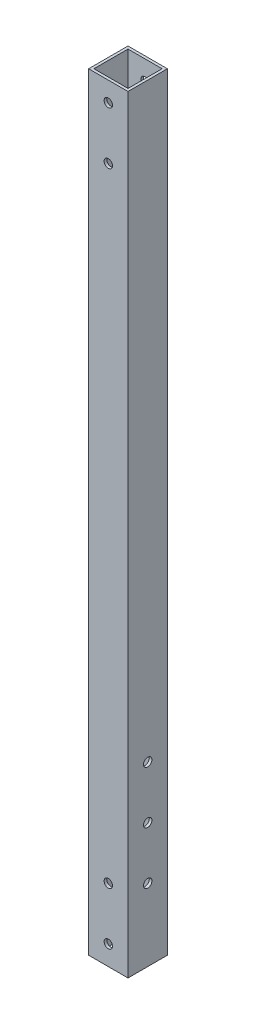
ISO-10303-21;
HEADER;
FILE_DESCRIPTION(('STEP AP214'),'2;1');
FILE_NAME('part.step','',(''),(''),'','','');
FILE_SCHEMA(('AUTOMOTIVE_DESIGN { 1 0 10303 214 1 1 1 1 }'));
ENDSEC;
DATA;
#1=APPLICATION_CONTEXT('core data for automotive mechanical design processes');
#2=APPLICATION_PROTOCOL_DEFINITION('international standard','automotive_design',2000,#1);
#3=PRODUCT_CONTEXT('',#1,'mechanical');
#4=PRODUCT('Part','Part','',(#3));
#5=PRODUCT_RELATED_PRODUCT_CATEGORY('part','',(#4));
#6=PRODUCT_DEFINITION_FORMATION('','',#4);
#7=PRODUCT_DEFINITION_CONTEXT('part definition',#1,'design');
#8=PRODUCT_DEFINITION('design','',#6,#7);
#9=PRODUCT_DEFINITION_SHAPE('','',#8);
#10=(LENGTH_UNIT() NAMED_UNIT(*) SI_UNIT(.MILLI.,.METRE.));
#11=(NAMED_UNIT(*) PLANE_ANGLE_UNIT() SI_UNIT($,.RADIAN.));
#12=(NAMED_UNIT(*) SI_UNIT($,.STERADIAN.) SOLID_ANGLE_UNIT());
#13=UNCERTAINTY_MEASURE_WITH_UNIT(LENGTH_MEASURE(1.E-05),#10,'distance_accuracy_value','');
#14=(GEOMETRIC_REPRESENTATION_CONTEXT(3) GLOBAL_UNCERTAINTY_ASSIGNED_CONTEXT((#13)) GLOBAL_UNIT_ASSIGNED_CONTEXT((#10,
#11,#12)) REPRESENTATION_CONTEXT('',''));
#15=CARTESIAN_POINT('',(0.,0.,0.));
#16=DIRECTION('',(0.,0.,1.));
#17=DIRECTION('',(1.,0.,0.));
#18=AXIS2_PLACEMENT_3D('',#15,#16,#17);
#19=CARTESIAN_POINT('',(0.,292.5,0.));
#20=DIRECTION('',(0.,1.,0.));
#21=DIRECTION('',(0.,0.,1.));
#22=AXIS2_PLACEMENT_3D('',#19,#20,#21);
#23=PLANE('',#22);
#24=DIRECTION('',(0.,0.,-1.));
#25=VECTOR('',#24,1.);
#26=CARTESIAN_POINT('',(7.5,292.5,7.5));
#27=LINE('',#26,#25);
#28=CARTESIAN_POINT('',(7.5,292.5,7.5));
#29=VERTEX_POINT('',#28);
#30=CARTESIAN_POINT('',(7.5,292.5,-7.5));
#31=VERTEX_POINT('',#30);
#32=EDGE_CURVE('E187',#29,#31,#27,.T.);
#33=ORIENTED_EDGE('',*,*,#32,.T.);
#34=DIRECTION('',(-1.,0.,0.));
#35=VECTOR('',#34,1.);
#36=CARTESIAN_POINT('',(-7.5,292.5,-7.5));
#37=LINE('',#36,#35);
#38=CARTESIAN_POINT('',(-7.5,292.5,-7.5));
#39=VERTEX_POINT('',#38);
#40=EDGE_CURVE('E191',#31,#39,#37,.T.);
#41=ORIENTED_EDGE('',*,*,#40,.T.);
#42=DIRECTION('',(0.,0.,1.));
#43=VECTOR('',#42,1.);
#44=CARTESIAN_POINT('',(-7.5,292.5,7.5));
#45=LINE('',#44,#43);
#46=CARTESIAN_POINT('',(-7.5,292.5,7.5));
#47=VERTEX_POINT('',#46);
#48=EDGE_CURVE('E195',#39,#47,#45,.T.);
#49=ORIENTED_EDGE('',*,*,#48,.T.);
#50=DIRECTION('',(1.,0.,0.));
#51=VECTOR('',#50,1.);
#52=CARTESIAN_POINT('',(-7.5,292.5,7.5));
#53=LINE('',#52,#51);
#54=EDGE_CURVE('E198',#47,#29,#53,.T.);
#55=ORIENTED_EDGE('',*,*,#54,.T.);
#56=EDGE_LOOP('',(#33,#41,#49,#55));
#57=FACE_BOUND('',#56,.T.);
#58=DIRECTION('',(-1.,0.,0.));
#59=VECTOR('',#58,1.);
#60=CARTESIAN_POINT('',(0.,292.5,-6.5));
#61=LINE('',#60,#59);
#62=CARTESIAN_POINT('',(6.5,292.5,-6.5));
#63=VERTEX_POINT('',#62);
#64=CARTESIAN_POINT('',(-6.5,292.5,-6.5));
#65=VERTEX_POINT('',#64);
#66=EDGE_CURVE('E146',#63,#65,#61,.T.);
#67=ORIENTED_EDGE('',*,*,#66,.F.);
#68=DIRECTION('',(0.,0.,-1.));
#69=VECTOR('',#68,1.);
#70=CARTESIAN_POINT('',(6.5,292.5,0.));
#71=LINE('',#70,#69);
#72=CARTESIAN_POINT('',(6.5,292.5,6.5));
#73=VERTEX_POINT('',#72);
#74=EDGE_CURVE('E137',#73,#63,#71,.T.);
#75=ORIENTED_EDGE('',*,*,#74,.F.);
#76=DIRECTION('',(1.,0.,0.));
#77=VECTOR('',#76,1.);
#78=CARTESIAN_POINT('',(0.,292.5,6.5));
#79=LINE('',#78,#77);
#80=CARTESIAN_POINT('',(-6.5,292.5,6.5));
#81=VERTEX_POINT('',#80);
#82=EDGE_CURVE('E163',#81,#73,#79,.T.);
#83=ORIENTED_EDGE('',*,*,#82,.F.);
#84=DIRECTION('',(0.,0.,1.));
#85=VECTOR('',#84,1.);
#86=CARTESIAN_POINT('',(-6.5,292.5,0.));
#87=LINE('',#86,#85);
#88=EDGE_CURVE('E159',#65,#81,#87,.T.);
#89=ORIENTED_EDGE('',*,*,#88,.F.);
#90=EDGE_LOOP('',(#67,#75,#83,#89));
#91=FACE_BOUND('',#90,.T.);
#92=ADVANCED_FACE('F69',(#57,#91),#23,.T.);
#93=CARTESIAN_POINT('',(0.,0.,0.));
#94=DIRECTION('',(0.,1.,0.));
#95=DIRECTION('',(0.,0.,1.));
#96=AXIS2_PLACEMENT_3D('',#93,#94,#95);
#97=PLANE('',#96);
#98=DIRECTION('',(0.,0.,-1.));
#99=VECTOR('',#98,1.);
#100=CARTESIAN_POINT('',(7.5,0.,7.5));
#101=LINE('',#100,#99);
#102=CARTESIAN_POINT('',(7.5,0.,7.5));
#103=VERTEX_POINT('',#102);
#104=CARTESIAN_POINT('',(7.5,0.,-7.5));
#105=VERTEX_POINT('',#104);
#106=EDGE_CURVE('E155',#103,#105,#101,.T.);
#107=ORIENTED_EDGE('',*,*,#106,.F.);
#108=DIRECTION('',(1.,0.,0.));
#109=VECTOR('',#108,1.);
#110=CARTESIAN_POINT('',(-7.5,0.,7.5));
#111=LINE('',#110,#109);
#112=CARTESIAN_POINT('',(-7.5,0.,7.5));
#113=VERTEX_POINT('',#112);
#114=EDGE_CURVE('E192',#113,#103,#111,.T.);
#115=ORIENTED_EDGE('',*,*,#114,.F.);
#116=DIRECTION('',(0.,0.,1.));
#117=VECTOR('',#116,1.);
#118=CARTESIAN_POINT('',(-7.5,0.,7.5));
#119=LINE('',#118,#117);
#120=CARTESIAN_POINT('',(-7.5,0.,-7.5));
#121=VERTEX_POINT('',#120);
#122=EDGE_CURVE('E208',#121,#113,#119,.T.);
#123=ORIENTED_EDGE('',*,*,#122,.F.);
#124=DIRECTION('',(-1.,0.,0.));
#125=VECTOR('',#124,1.);
#126=CARTESIAN_POINT('',(-7.5,0.,-7.5));
#127=LINE('',#126,#125);
#128=EDGE_CURVE('E205',#105,#121,#127,.T.);
#129=ORIENTED_EDGE('',*,*,#128,.F.);
#130=EDGE_LOOP('',(#107,#115,#123,#129));
#131=FACE_BOUND('',#130,.T.);
#132=DIRECTION('',(0.,0.,-1.));
#133=VECTOR('',#132,1.);
#134=CARTESIAN_POINT('',(6.5,0.,0.));
#135=LINE('',#134,#133);
#136=CARTESIAN_POINT('',(6.5,0.,6.5));
#137=VERTEX_POINT('',#136);
#138=CARTESIAN_POINT('',(6.5,0.,-6.5));
#139=VERTEX_POINT('',#138);
#140=EDGE_CURVE('E95',#137,#139,#135,.T.);
#141=ORIENTED_EDGE('',*,*,#140,.T.);
#142=DIRECTION('',(-1.,0.,0.));
#143=VECTOR('',#142,1.);
#144=CARTESIAN_POINT('',(0.,0.,-6.5));
#145=LINE('',#144,#143);
#146=CARTESIAN_POINT('',(-6.5,0.,-6.5));
#147=VERTEX_POINT('',#146);
#148=EDGE_CURVE('E153',#139,#147,#145,.T.);
#149=ORIENTED_EDGE('',*,*,#148,.T.);
#150=DIRECTION('',(0.,0.,1.));
#151=VECTOR('',#150,1.);
#152=CARTESIAN_POINT('',(-6.5,0.,0.));
#153=LINE('',#152,#151);
#154=CARTESIAN_POINT('',(-6.5,0.,6.5));
#155=VERTEX_POINT('',#154);
#156=EDGE_CURVE('E174',#147,#155,#153,.T.);
#157=ORIENTED_EDGE('',*,*,#156,.T.);
#158=DIRECTION('',(1.,0.,0.));
#159=VECTOR('',#158,1.);
#160=CARTESIAN_POINT('',(0.,0.,6.5));
#161=LINE('',#160,#159);
#162=EDGE_CURVE('E147',#155,#137,#161,.T.);
#163=ORIENTED_EDGE('',*,*,#162,.T.);
#164=EDGE_LOOP('',(#141,#149,#157,#163));
#165=FACE_BOUND('',#164,.T.);
#166=ADVANCED_FACE('F349',(#131,#165),#97,.F.);
#167=CARTESIAN_POINT('',(7.5,292.5,7.5));
#168=DIRECTION('',(-1.,0.,0.));
#169=DIRECTION('',(0.,0.,1.));
#170=AXIS2_PLACEMENT_3D('',#167,#168,#169);
#171=PLANE('',#170);
#172=CARTESIAN_POINT('',(7.5,27.5,0.));
#173=DIRECTION('',(1.,0.,0.));
#174=DIRECTION('',(0.,0.,-1.));
#175=AXIS2_PLACEMENT_3D('',#172,#173,#174);
#176=CIRCLE('',#175,1.6);
#177=CARTESIAN_POINT('',(7.5,27.5,-1.6));
#178=VERTEX_POINT('',#177);
#179=EDGE_CURVE('E398',#178,#178,#176,.T.);
#180=ORIENTED_EDGE('',*,*,#179,.F.);
#181=EDGE_LOOP('',(#180));
#182=FACE_BOUND('',#181,.T.);
#183=CARTESIAN_POINT('',(7.5,47.5,0.));
#184=DIRECTION('',(1.,0.,0.));
#185=DIRECTION('',(0.,0.,-1.));
#186=AXIS2_PLACEMENT_3D('',#183,#184,#185);
#187=CIRCLE('',#186,1.6);
#188=CARTESIAN_POINT('',(7.5,47.5,-1.6));
#189=VERTEX_POINT('',#188);
#190=EDGE_CURVE('E392',#189,#189,#187,.T.);
#191=ORIENTED_EDGE('',*,*,#190,.F.);
#192=EDGE_LOOP('',(#191));
#193=FACE_BOUND('',#192,.T.);
#194=CARTESIAN_POINT('',(7.5,67.5,0.));
#195=DIRECTION('',(1.,0.,0.));
#196=DIRECTION('',(0.,0.,-1.));
#197=AXIS2_PLACEMENT_3D('',#194,#195,#196);
#198=CIRCLE('',#197,1.60000000000001);
#199=CARTESIAN_POINT('',(7.5,67.5,-1.60000000000001));
#200=VERTEX_POINT('',#199);
#201=EDGE_CURVE('E386',#200,#200,#198,.T.);
#202=ORIENTED_EDGE('',*,*,#201,.F.);
#203=EDGE_LOOP('',(#202));
#204=FACE_BOUND('',#203,.T.);
#205=ORIENTED_EDGE('',*,*,#106,.T.);
#206=DIRECTION('',(0.,-1.,0.));
#207=VECTOR('',#206,1.);
#208=CARTESIAN_POINT('',(7.5,292.5,-7.5));
#209=LINE('',#208,#207);
#210=EDGE_CURVE('E12',#31,#105,#209,.T.);
#211=ORIENTED_EDGE('',*,*,#210,.F.);
#212=ORIENTED_EDGE('',*,*,#32,.F.);
#213=DIRECTION('',(0.,-1.,0.));
#214=VECTOR('',#213,1.);
#215=CARTESIAN_POINT('',(7.5,292.5,7.5));
#216=LINE('',#215,#214);
#217=EDGE_CURVE('E201',#29,#103,#216,.T.);
#218=ORIENTED_EDGE('',*,*,#217,.T.);
#219=EDGE_LOOP('',(#205,#211,#212,#218));
#220=FACE_BOUND('',#219,.T.);
#221=ADVANCED_FACE('F71',(#182,#193,#204,#220),#171,.F.);
#222=CARTESIAN_POINT('',(-7.5,292.5,-7.5));
#223=DIRECTION('',(0.,0.,1.));
#224=DIRECTION('',(1.,0.,0.));
#225=AXIS2_PLACEMENT_3D('',#222,#223,#224);
#226=PLANE('',#225);
#227=CARTESIAN_POINT('',(0.,7.5,-7.5));
#228=DIRECTION('',(0.,0.,1.));
#229=DIRECTION('',(1.,0.,0.));
#230=AXIS2_PLACEMENT_3D('',#227,#228,#229);
#231=CIRCLE('',#230,1.6);
#232=CARTESIAN_POINT('',(1.6,7.5,-7.5));
#233=VERTEX_POINT('',#232);
#234=EDGE_CURVE('E228',#233,#233,#231,.T.);
#235=ORIENTED_EDGE('',*,*,#234,.T.);
#236=EDGE_LOOP('',(#235));
#237=FACE_BOUND('',#236,.T.);
#238=CARTESIAN_POINT('',(0.,27.5,-7.5));
#239=DIRECTION('',(0.,0.,1.));
#240=DIRECTION('',(1.,0.,0.));
#241=AXIS2_PLACEMENT_3D('',#238,#239,#240);
#242=CIRCLE('',#241,1.6);
#243=CARTESIAN_POINT('',(1.6,27.5,-7.5));
#244=VERTEX_POINT('',#243);
#245=EDGE_CURVE('E282',#244,#244,#242,.T.);
#246=ORIENTED_EDGE('',*,*,#245,.T.);
#247=EDGE_LOOP('',(#246));
#248=FACE_BOUND('',#247,.T.);
#249=CARTESIAN_POINT('',(0.,265.,-7.5));
#250=DIRECTION('',(0.,0.,1.));
#251=DIRECTION('',(-1.,0.,0.));
#252=AXIS2_PLACEMENT_3D('',#249,#250,#251);
#253=CIRCLE('',#252,1.60000000000001);
#254=CARTESIAN_POINT('',(-1.60000000000001,265.,-7.5));
#255=VERTEX_POINT('',#254);
#256=EDGE_CURVE('E290',#255,#255,#253,.T.);
#257=ORIENTED_EDGE('',*,*,#256,.T.);
#258=EDGE_LOOP('',(#257));
#259=FACE_BOUND('',#258,.T.);
#260=CARTESIAN_POINT('',(0.,285.,-7.5));
#261=DIRECTION('',(0.,0.,1.));
#262=DIRECTION('',(-1.,0.,0.));
#263=AXIS2_PLACEMENT_3D('',#260,#261,#262);
#264=CIRCLE('',#263,1.59999999999999);
#265=CARTESIAN_POINT('',(-1.59999999999999,285.,-7.5));
#266=VERTEX_POINT('',#265);
#267=EDGE_CURVE('E270',#266,#266,#264,.T.);
#268=ORIENTED_EDGE('',*,*,#267,.T.);
#269=EDGE_LOOP('',(#268));
#270=FACE_BOUND('',#269,.T.);
#271=ORIENTED_EDGE('',*,*,#128,.T.);
#272=DIRECTION('',(0.,-1.,0.));
#273=VECTOR('',#272,1.);
#274=CARTESIAN_POINT('',(-7.5,292.5,-7.5));
#275=LINE('',#274,#273);
#276=EDGE_CURVE('E79',#39,#121,#275,.T.);
#277=ORIENTED_EDGE('',*,*,#276,.F.);
#278=ORIENTED_EDGE('',*,*,#40,.F.);
#279=ORIENTED_EDGE('',*,*,#210,.T.);
#280=EDGE_LOOP('',(#271,#277,#278,#279));
#281=FACE_BOUND('',#280,.T.);
#282=ADVANCED_FACE('F335',(#237,#248,#259,#270,#281),#226,.F.);
#283=CARTESIAN_POINT('',(-7.5,292.5,7.5));
#284=DIRECTION('',(1.,0.,0.));
#285=DIRECTION('',(0.,0.,-1.));
#286=AXIS2_PLACEMENT_3D('',#283,#284,#285);
#287=PLANE('',#286);
#288=CARTESIAN_POINT('',(-7.5,27.5,0.));
#289=DIRECTION('',(1.,0.,0.));
#290=DIRECTION('',(0.,0.,-1.));
#291=AXIS2_PLACEMENT_3D('',#288,#289,#290);
#292=CIRCLE('',#291,1.6);
#293=CARTESIAN_POINT('',(-7.5,27.5,-1.6));
#294=VERTEX_POINT('',#293);
#295=EDGE_CURVE('E247',#294,#294,#292,.T.);
#296=ORIENTED_EDGE('',*,*,#295,.T.);
#297=EDGE_LOOP('',(#296));
#298=FACE_BOUND('',#297,.T.);
#299=CARTESIAN_POINT('',(-7.5,47.5,0.));
#300=DIRECTION('',(1.,0.,0.));
#301=DIRECTION('',(0.,0.,-1.));
#302=AXIS2_PLACEMENT_3D('',#299,#300,#301);
#303=CIRCLE('',#302,1.6);
#304=CARTESIAN_POINT('',(-7.5,47.5,-1.6));
#305=VERTEX_POINT('',#304);
#306=EDGE_CURVE('E381',#305,#305,#303,.T.);
#307=ORIENTED_EDGE('',*,*,#306,.T.);
#308=EDGE_LOOP('',(#307));
#309=FACE_BOUND('',#308,.T.);
#310=CARTESIAN_POINT('',(-7.5,67.5,0.));
#311=DIRECTION('',(1.,0.,0.));
#312=DIRECTION('',(0.,0.,-1.));
#313=AXIS2_PLACEMENT_3D('',#310,#311,#312);
#314=CIRCLE('',#313,1.60000000000001);
#315=CARTESIAN_POINT('',(-7.5,67.5,-1.60000000000001));
#316=VERTEX_POINT('',#315);
#317=EDGE_CURVE('E263',#316,#316,#314,.T.);
#318=ORIENTED_EDGE('',*,*,#317,.T.);
#319=EDGE_LOOP('',(#318));
#320=FACE_BOUND('',#319,.T.);
#321=ORIENTED_EDGE('',*,*,#122,.T.);
#322=DIRECTION('',(0.,-1.,0.));
#323=VECTOR('',#322,1.);
#324=CARTESIAN_POINT('',(-7.5,292.5,7.5));
#325=LINE('',#324,#323);
#326=EDGE_CURVE('E216',#47,#113,#325,.T.);
#327=ORIENTED_EDGE('',*,*,#326,.F.);
#328=ORIENTED_EDGE('',*,*,#48,.F.);
#329=ORIENTED_EDGE('',*,*,#276,.T.);
#330=EDGE_LOOP('',(#321,#327,#328,#329));
#331=FACE_BOUND('',#330,.T.);
#332=ADVANCED_FACE('F338',(#298,#309,#320,#331),#287,.F.);
#333=CARTESIAN_POINT('',(-7.5,292.5,7.5));
#334=DIRECTION('',(0.,0.,-1.));
#335=DIRECTION('',(-1.,0.,0.));
#336=AXIS2_PLACEMENT_3D('',#333,#334,#335);
#337=PLANE('',#336);
#338=CARTESIAN_POINT('',(0.,7.5,7.5));
#339=DIRECTION('',(0.,0.,1.));
#340=DIRECTION('',(1.,0.,0.));
#341=AXIS2_PLACEMENT_3D('',#338,#339,#340);
#342=CIRCLE('',#341,1.6);
#343=CARTESIAN_POINT('',(1.6,7.5,7.5));
#344=VERTEX_POINT('',#343);
#345=EDGE_CURVE('E274',#344,#344,#342,.T.);
#346=ORIENTED_EDGE('',*,*,#345,.F.);
#347=EDGE_LOOP('',(#346));
#348=FACE_BOUND('',#347,.T.);
#349=CARTESIAN_POINT('',(0.,27.5,7.5));
#350=DIRECTION('',(0.,0.,1.));
#351=DIRECTION('',(1.,0.,0.));
#352=AXIS2_PLACEMENT_3D('',#349,#350,#351);
#353=CIRCLE('',#352,1.6);
#354=CARTESIAN_POINT('',(1.6,27.5,7.5));
#355=VERTEX_POINT('',#354);
#356=EDGE_CURVE('E278',#355,#355,#353,.T.);
#357=ORIENTED_EDGE('',*,*,#356,.F.);
#358=EDGE_LOOP('',(#357));
#359=FACE_BOUND('',#358,.T.);
#360=CARTESIAN_POINT('',(0.,265.,7.5));
#361=DIRECTION('',(0.,0.,1.));
#362=DIRECTION('',(-1.,0.,0.));
#363=AXIS2_PLACEMENT_3D('',#360,#361,#362);
#364=CIRCLE('',#363,1.60000000000001);
#365=CARTESIAN_POINT('',(-1.60000000000001,265.,7.5));
#366=VERTEX_POINT('',#365);
#367=EDGE_CURVE('E286',#366,#366,#364,.T.);
#368=ORIENTED_EDGE('',*,*,#367,.F.);
#369=EDGE_LOOP('',(#368));
#370=FACE_BOUND('',#369,.T.);
#371=CARTESIAN_POINT('',(0.,285.,7.5));
#372=DIRECTION('',(0.,0.,1.));
#373=DIRECTION('',(-1.,0.,0.));
#374=AXIS2_PLACEMENT_3D('',#371,#372,#373);
#375=CIRCLE('',#374,1.59999999999999);
#376=CARTESIAN_POINT('',(-1.59999999999999,285.,7.5));
#377=VERTEX_POINT('',#376);
#378=EDGE_CURVE('E294',#377,#377,#375,.T.);
#379=ORIENTED_EDGE('',*,*,#378,.F.);
#380=EDGE_LOOP('',(#379));
#381=FACE_BOUND('',#380,.T.);
#382=ORIENTED_EDGE('',*,*,#114,.T.);
#383=ORIENTED_EDGE('',*,*,#217,.F.);
#384=ORIENTED_EDGE('',*,*,#54,.F.);
#385=ORIENTED_EDGE('',*,*,#326,.T.);
#386=EDGE_LOOP('',(#382,#383,#384,#385));
#387=FACE_BOUND('',#386,.T.);
#388=ADVANCED_FACE('F353',(#348,#359,#370,#381,#387),#337,.F.);
#389=CARTESIAN_POINT('',(6.5,292.5,0.));
#390=DIRECTION('',(-1.,0.,0.));
#391=DIRECTION('',(0.,0.,1.));
#392=AXIS2_PLACEMENT_3D('',#389,#390,#391);
#393=PLANE('',#392);
#394=CARTESIAN_POINT('',(6.5,27.5,0.));
#395=DIRECTION('',(-1.,0.,0.));
#396=DIRECTION('',(0.,0.,1.));
#397=AXIS2_PLACEMENT_3D('',#394,#395,#396);
#398=CIRCLE('',#397,1.6);
#399=CARTESIAN_POINT('',(6.5,27.5,1.6));
#400=VERTEX_POINT('',#399);
#401=EDGE_CURVE('E266',#400,#400,#398,.T.);
#402=ORIENTED_EDGE('',*,*,#401,.F.);
#403=EDGE_LOOP('',(#402));
#404=FACE_BOUND('',#403,.T.);
#405=CARTESIAN_POINT('',(6.5,47.5,0.));
#406=DIRECTION('',(-1.,0.,0.));
#407=DIRECTION('',(0.,0.,1.));
#408=AXIS2_PLACEMENT_3D('',#405,#406,#407);
#409=CIRCLE('',#408,1.6);
#410=CARTESIAN_POINT('',(6.5,47.5,1.6));
#411=VERTEX_POINT('',#410);
#412=EDGE_CURVE('E251',#411,#411,#409,.T.);
#413=ORIENTED_EDGE('',*,*,#412,.F.);
#414=EDGE_LOOP('',(#413));
#415=FACE_BOUND('',#414,.T.);
#416=CARTESIAN_POINT('',(6.5,67.5,0.));
#417=DIRECTION('',(-1.,0.,0.));
#418=DIRECTION('',(0.,0.,1.));
#419=AXIS2_PLACEMENT_3D('',#416,#417,#418);
#420=CIRCLE('',#419,1.60000000000001);
#421=CARTESIAN_POINT('',(6.5,67.5,1.60000000000001));
#422=VERTEX_POINT('',#421);
#423=EDGE_CURVE('E246',#422,#422,#420,.T.);
#424=ORIENTED_EDGE('',*,*,#423,.F.);
#425=EDGE_LOOP('',(#424));
#426=FACE_BOUND('',#425,.T.);
#427=ORIENTED_EDGE('',*,*,#140,.F.);
#428=DIRECTION('',(0.,-1.,0.));
#429=VECTOR('',#428,1.);
#430=CARTESIAN_POINT('',(6.5,292.5,6.5));
#431=LINE('',#430,#429);
#432=EDGE_CURVE('E141',#73,#137,#431,.T.);
#433=ORIENTED_EDGE('',*,*,#432,.F.);
#434=ORIENTED_EDGE('',*,*,#74,.T.);
#435=DIRECTION('',(0.,-1.,0.));
#436=VECTOR('',#435,1.);
#437=CARTESIAN_POINT('',(6.5,292.5,-6.5));
#438=LINE('',#437,#436);
#439=EDGE_CURVE('E140',#63,#139,#438,.T.);
#440=ORIENTED_EDGE('',*,*,#439,.T.);
#441=EDGE_LOOP('',(#427,#433,#434,#440));
#442=FACE_BOUND('',#441,.T.);
#443=ADVANCED_FACE('F139',(#404,#415,#426,#442),#393,.T.);
#444=CARTESIAN_POINT('',(0.,292.5,-6.5));
#445=DIRECTION('',(0.,0.,1.));
#446=DIRECTION('',(1.,0.,0.));
#447=AXIS2_PLACEMENT_3D('',#444,#445,#446);
#448=PLANE('',#447);
#449=CARTESIAN_POINT('',(0.,7.5,-6.5));
#450=DIRECTION('',(0.,0.,1.));
#451=DIRECTION('',(1.,0.,0.));
#452=AXIS2_PLACEMENT_3D('',#449,#450,#451);
#453=CIRCLE('',#452,1.6);
#454=CARTESIAN_POINT('',(1.6,7.5,-6.5));
#455=VERTEX_POINT('',#454);
#456=EDGE_CURVE('E171',#455,#455,#453,.T.);
#457=ORIENTED_EDGE('',*,*,#456,.F.);
#458=EDGE_LOOP('',(#457));
#459=FACE_BOUND('',#458,.T.);
#460=CARTESIAN_POINT('',(0.,27.5,-6.5));
#461=DIRECTION('',(0.,0.,1.));
#462=DIRECTION('',(1.,0.,0.));
#463=AXIS2_PLACEMENT_3D('',#460,#461,#462);
#464=CIRCLE('',#463,1.6);
#465=CARTESIAN_POINT('',(1.6,27.5,-6.5));
#466=VERTEX_POINT('',#465);
#467=EDGE_CURVE('E238',#466,#466,#464,.T.);
#468=ORIENTED_EDGE('',*,*,#467,.F.);
#469=EDGE_LOOP('',(#468));
#470=FACE_BOUND('',#469,.T.);
#471=CARTESIAN_POINT('',(0.,265.,-6.5));
#472=DIRECTION('',(0.,0.,1.));
#473=DIRECTION('',(1.,0.,0.));
#474=AXIS2_PLACEMENT_3D('',#471,#472,#473);
#475=CIRCLE('',#474,1.60000000000001);
#476=CARTESIAN_POINT('',(1.60000000000001,265.,-6.5));
#477=VERTEX_POINT('',#476);
#478=EDGE_CURVE('E233',#477,#477,#475,.T.);
#479=ORIENTED_EDGE('',*,*,#478,.F.);
#480=EDGE_LOOP('',(#479));
#481=FACE_BOUND('',#480,.T.);
#482=CARTESIAN_POINT('',(0.,285.,-6.5));
#483=DIRECTION('',(0.,0.,1.));
#484=DIRECTION('',(1.,0.,0.));
#485=AXIS2_PLACEMENT_3D('',#482,#483,#484);
#486=CIRCLE('',#485,1.59999999999999);
#487=CARTESIAN_POINT('',(1.59999999999999,285.,-6.5));
#488=VERTEX_POINT('',#487);
#489=EDGE_CURVE('E227',#488,#488,#486,.T.);
#490=ORIENTED_EDGE('',*,*,#489,.F.);
#491=EDGE_LOOP('',(#490));
#492=FACE_BOUND('',#491,.T.);
#493=ORIENTED_EDGE('',*,*,#148,.F.);
#494=ORIENTED_EDGE('',*,*,#439,.F.);
#495=ORIENTED_EDGE('',*,*,#66,.T.);
#496=DIRECTION('',(0.,-1.,0.));
#497=VECTOR('',#496,1.);
#498=CARTESIAN_POINT('',(-6.5,292.5,-6.5));
#499=LINE('',#498,#497);
#500=EDGE_CURVE('E156',#65,#147,#499,.T.);
#501=ORIENTED_EDGE('',*,*,#500,.T.);
#502=EDGE_LOOP('',(#493,#494,#495,#501));
#503=FACE_BOUND('',#502,.T.);
#504=ADVANCED_FACE('F150',(#459,#470,#481,#492,#503),#448,.T.);
#505=CARTESIAN_POINT('',(-6.5,292.5,0.));
#506=DIRECTION('',(1.,0.,0.));
#507=DIRECTION('',(0.,0.,-1.));
#508=AXIS2_PLACEMENT_3D('',#505,#506,#507);
#509=PLANE('',#508);
#510=CARTESIAN_POINT('',(-6.5,27.5,0.));
#511=DIRECTION('',(1.,0.,0.));
#512=DIRECTION('',(0.,0.,-1.));
#513=AXIS2_PLACEMENT_3D('',#510,#511,#512);
#514=CIRCLE('',#513,1.6);
#515=CARTESIAN_POINT('',(-6.5,27.5,-1.6));
#516=VERTEX_POINT('',#515);
#517=EDGE_CURVE('E73',#516,#516,#514,.T.);
#518=ORIENTED_EDGE('',*,*,#517,.F.);
#519=EDGE_LOOP('',(#518));
#520=FACE_BOUND('',#519,.T.);
#521=CARTESIAN_POINT('',(-6.5,47.5,0.));
#522=DIRECTION('',(1.,0.,0.));
#523=DIRECTION('',(0.,0.,-1.));
#524=AXIS2_PLACEMENT_3D('',#521,#522,#523);
#525=CIRCLE('',#524,1.6);
#526=CARTESIAN_POINT('',(-6.5,47.5,-1.6));
#527=VERTEX_POINT('',#526);
#528=EDGE_CURVE('E248',#527,#527,#525,.T.);
#529=ORIENTED_EDGE('',*,*,#528,.F.);
#530=EDGE_LOOP('',(#529));
#531=FACE_BOUND('',#530,.T.);
#532=CARTESIAN_POINT('',(-6.5,67.5,0.));
#533=DIRECTION('',(1.,0.,0.));
#534=DIRECTION('',(0.,0.,-1.));
#535=AXIS2_PLACEMENT_3D('',#532,#533,#534);
#536=CIRCLE('',#535,1.60000000000001);
#537=CARTESIAN_POINT('',(-6.5,67.5,-1.60000000000001));
#538=VERTEX_POINT('',#537);
#539=EDGE_CURVE('E243',#538,#538,#536,.T.);
#540=ORIENTED_EDGE('',*,*,#539,.F.);
#541=EDGE_LOOP('',(#540));
#542=FACE_BOUND('',#541,.T.);
#543=ORIENTED_EDGE('',*,*,#156,.F.);
#544=ORIENTED_EDGE('',*,*,#500,.F.);
#545=ORIENTED_EDGE('',*,*,#88,.T.);
#546=DIRECTION('',(0.,-1.,0.));
#547=VECTOR('',#546,1.);
#548=CARTESIAN_POINT('',(-6.5,292.5,6.5));
#549=LINE('',#548,#547);
#550=EDGE_CURVE('E87',#81,#155,#549,.T.);
#551=ORIENTED_EDGE('',*,*,#550,.T.);
#552=EDGE_LOOP('',(#543,#544,#545,#551));
#553=FACE_BOUND('',#552,.T.);
#554=ADVANCED_FACE('F318',(#520,#531,#542,#553),#509,.T.);
#555=CARTESIAN_POINT('',(0.,292.5,6.5));
#556=DIRECTION('',(0.,0.,-1.));
#557=DIRECTION('',(-1.,0.,0.));
#558=AXIS2_PLACEMENT_3D('',#555,#556,#557);
#559=PLANE('',#558);
#560=CARTESIAN_POINT('',(0.,7.5,6.5));
#561=DIRECTION('',(0.,0.,-1.));
#562=DIRECTION('',(-1.,0.,0.));
#563=AXIS2_PLACEMENT_3D('',#560,#561,#562);
#564=CIRCLE('',#563,1.6);
#565=CARTESIAN_POINT('',(-1.6,7.5,6.5));
#566=VERTEX_POINT('',#565);
#567=EDGE_CURVE('E239',#566,#566,#564,.T.);
#568=ORIENTED_EDGE('',*,*,#567,.F.);
#569=EDGE_LOOP('',(#568));
#570=FACE_BOUND('',#569,.T.);
#571=CARTESIAN_POINT('',(0.,27.5,6.5));
#572=DIRECTION('',(0.,0.,-1.));
#573=DIRECTION('',(-1.,0.,0.));
#574=AXIS2_PLACEMENT_3D('',#571,#572,#573);
#575=CIRCLE('',#574,1.6);
#576=CARTESIAN_POINT('',(-1.6,27.5,6.5));
#577=VERTEX_POINT('',#576);
#578=EDGE_CURVE('E234',#577,#577,#575,.T.);
#579=ORIENTED_EDGE('',*,*,#578,.F.);
#580=EDGE_LOOP('',(#579));
#581=FACE_BOUND('',#580,.T.);
#582=CARTESIAN_POINT('',(0.,265.,6.5));
#583=DIRECTION('',(0.,0.,-1.));
#584=DIRECTION('',(-1.,0.,0.));
#585=AXIS2_PLACEMENT_3D('',#582,#583,#584);
#586=CIRCLE('',#585,1.60000000000001);
#587=CARTESIAN_POINT('',(-1.60000000000001,265.,6.5));
#588=VERTEX_POINT('',#587);
#589=EDGE_CURVE('E229',#588,#588,#586,.T.);
#590=ORIENTED_EDGE('',*,*,#589,.F.);
#591=EDGE_LOOP('',(#590));
#592=FACE_BOUND('',#591,.T.);
#593=CARTESIAN_POINT('',(0.,285.,6.5));
#594=DIRECTION('',(0.,0.,-1.));
#595=DIRECTION('',(-1.,0.,0.));
#596=AXIS2_PLACEMENT_3D('',#593,#594,#595);
#597=CIRCLE('',#596,1.59999999999999);
#598=CARTESIAN_POINT('',(-1.59999999999999,285.,6.5));
#599=VERTEX_POINT('',#598);
#600=EDGE_CURVE('E223',#599,#599,#597,.T.);
#601=ORIENTED_EDGE('',*,*,#600,.F.);
#602=EDGE_LOOP('',(#601));
#603=FACE_BOUND('',#602,.T.);
#604=ORIENTED_EDGE('',*,*,#162,.F.);
#605=ORIENTED_EDGE('',*,*,#550,.F.);
#606=ORIENTED_EDGE('',*,*,#82,.T.);
#607=ORIENTED_EDGE('',*,*,#432,.T.);
#608=EDGE_LOOP('',(#604,#605,#606,#607));
#609=FACE_BOUND('',#608,.T.);
#610=ADVANCED_FACE('F452',(#570,#581,#592,#603,#609),#559,.T.);
#611=CARTESIAN_POINT('',(0.,285.,-7.5));
#612=DIRECTION('',(0.,0.,1.));
#613=DIRECTION('',(1.,0.,0.));
#614=AXIS2_PLACEMENT_3D('',#611,#612,#613);
#615=CYLINDRICAL_SURFACE('',#614,1.59999999999999);
#616=ORIENTED_EDGE('',*,*,#600,.T.);
#617=EDGE_LOOP('',(#616));
#618=FACE_BOUND('',#617,.T.);
#619=ORIENTED_EDGE('',*,*,#378,.T.);
#620=EDGE_LOOP('',(#619));
#621=FACE_BOUND('',#620,.T.);
#622=ADVANCED_FACE('F332',(#618,#621),#615,.F.);
#623=CARTESIAN_POINT('',(0.,265.,-7.5));
#624=DIRECTION('',(0.,0.,1.));
#625=DIRECTION('',(1.,0.,0.));
#626=AXIS2_PLACEMENT_3D('',#623,#624,#625);
#627=CYLINDRICAL_SURFACE('',#626,1.60000000000001);
#628=ORIENTED_EDGE('',*,*,#589,.T.);
#629=EDGE_LOOP('',(#628));
#630=FACE_BOUND('',#629,.T.);
#631=ORIENTED_EDGE('',*,*,#367,.T.);
#632=EDGE_LOOP('',(#631));
#633=FACE_BOUND('',#632,.T.);
#634=ADVANCED_FACE('F446',(#630,#633),#627,.F.);
#635=CARTESIAN_POINT('',(0.,27.5,-7.5));
#636=DIRECTION('',(0.,0.,1.));
#637=DIRECTION('',(1.,0.,0.));
#638=AXIS2_PLACEMENT_3D('',#635,#636,#637);
#639=CYLINDRICAL_SURFACE('',#638,1.6);
#640=ORIENTED_EDGE('',*,*,#578,.T.);
#641=EDGE_LOOP('',(#640));
#642=FACE_BOUND('',#641,.T.);
#643=ORIENTED_EDGE('',*,*,#356,.T.);
#644=EDGE_LOOP('',(#643));
#645=FACE_BOUND('',#644,.T.);
#646=ADVANCED_FACE('F442',(#642,#645),#639,.F.);
#647=CARTESIAN_POINT('',(0.,7.5,-7.5));
#648=DIRECTION('',(0.,0.,1.));
#649=DIRECTION('',(1.,0.,0.));
#650=AXIS2_PLACEMENT_3D('',#647,#648,#649);
#651=CYLINDRICAL_SURFACE('',#650,1.6);
#652=ORIENTED_EDGE('',*,*,#567,.T.);
#653=EDGE_LOOP('',(#652));
#654=FACE_BOUND('',#653,.T.);
#655=ORIENTED_EDGE('',*,*,#345,.T.);
#656=EDGE_LOOP('',(#655));
#657=FACE_BOUND('',#656,.T.);
#658=ADVANCED_FACE('F330',(#654,#657),#651,.F.);
#659=ORIENTED_EDGE('',*,*,#489,.T.);
#660=EDGE_LOOP('',(#659));
#661=FACE_BOUND('',#660,.T.);
#662=ORIENTED_EDGE('',*,*,#267,.F.);
#663=EDGE_LOOP('',(#662));
#664=FACE_BOUND('',#663,.T.);
#665=ADVANCED_FACE('F326',(#661,#664),#615,.F.);
#666=ORIENTED_EDGE('',*,*,#478,.T.);
#667=EDGE_LOOP('',(#666));
#668=FACE_BOUND('',#667,.T.);
#669=ORIENTED_EDGE('',*,*,#256,.F.);
#670=EDGE_LOOP('',(#669));
#671=FACE_BOUND('',#670,.T.);
#672=ADVANCED_FACE('F329',(#668,#671),#627,.F.);
#673=ORIENTED_EDGE('',*,*,#467,.T.);
#674=EDGE_LOOP('',(#673));
#675=FACE_BOUND('',#674,.T.);
#676=ORIENTED_EDGE('',*,*,#245,.F.);
#677=EDGE_LOOP('',(#676));
#678=FACE_BOUND('',#677,.T.);
#679=ADVANCED_FACE('F438',(#675,#678),#639,.F.);
#680=ORIENTED_EDGE('',*,*,#456,.T.);
#681=EDGE_LOOP('',(#680));
#682=FACE_BOUND('',#681,.T.);
#683=ORIENTED_EDGE('',*,*,#234,.F.);
#684=EDGE_LOOP('',(#683));
#685=FACE_BOUND('',#684,.T.);
#686=ADVANCED_FACE('F313',(#682,#685),#651,.F.);
#687=CARTESIAN_POINT('',(-7.5,67.5,0.));
#688=DIRECTION('',(1.,0.,0.));
#689=DIRECTION('',(0.,0.,-1.));
#690=AXIS2_PLACEMENT_3D('',#687,#688,#689);
#691=CYLINDRICAL_SURFACE('',#690,1.60000000000001);
#692=ORIENTED_EDGE('',*,*,#539,.T.);
#693=EDGE_LOOP('',(#692));
#694=FACE_BOUND('',#693,.T.);
#695=ORIENTED_EDGE('',*,*,#317,.F.);
#696=EDGE_LOOP('',(#695));
#697=FACE_BOUND('',#696,.T.);
#698=ADVANCED_FACE('F425',(#694,#697),#691,.F.);
#699=CARTESIAN_POINT('',(-7.5,47.5,0.));
#700=DIRECTION('',(1.,0.,0.));
#701=DIRECTION('',(0.,0.,-1.));
#702=AXIS2_PLACEMENT_3D('',#699,#700,#701);
#703=CYLINDRICAL_SURFACE('',#702,1.6);
#704=ORIENTED_EDGE('',*,*,#528,.T.);
#705=EDGE_LOOP('',(#704));
#706=FACE_BOUND('',#705,.T.);
#707=ORIENTED_EDGE('',*,*,#306,.F.);
#708=EDGE_LOOP('',(#707));
#709=FACE_BOUND('',#708,.T.);
#710=ADVANCED_FACE('F416',(#706,#709),#703,.F.);
#711=CARTESIAN_POINT('',(-7.5,27.5,0.));
#712=DIRECTION('',(1.,0.,0.));
#713=DIRECTION('',(0.,0.,-1.));
#714=AXIS2_PLACEMENT_3D('',#711,#712,#713);
#715=CYLINDRICAL_SURFACE('',#714,1.6);
#716=ORIENTED_EDGE('',*,*,#517,.T.);
#717=EDGE_LOOP('',(#716));
#718=FACE_BOUND('',#717,.T.);
#719=ORIENTED_EDGE('',*,*,#295,.F.);
#720=EDGE_LOOP('',(#719));
#721=FACE_BOUND('',#720,.T.);
#722=ADVANCED_FACE('F423',(#718,#721),#715,.F.);
#723=ORIENTED_EDGE('',*,*,#423,.T.);
#724=EDGE_LOOP('',(#723));
#725=FACE_BOUND('',#724,.T.);
#726=ORIENTED_EDGE('',*,*,#201,.T.);
#727=EDGE_LOOP('',(#726));
#728=FACE_BOUND('',#727,.T.);
#729=ADVANCED_FACE('F413',(#725,#728),#691,.F.);
#730=ORIENTED_EDGE('',*,*,#412,.T.);
#731=EDGE_LOOP('',(#730));
#732=FACE_BOUND('',#731,.T.);
#733=ORIENTED_EDGE('',*,*,#190,.T.);
#734=EDGE_LOOP('',(#733));
#735=FACE_BOUND('',#734,.T.);
#736=ADVANCED_FACE('F411',(#732,#735),#703,.F.);
#737=ORIENTED_EDGE('',*,*,#401,.T.);
#738=EDGE_LOOP('',(#737));
#739=FACE_BOUND('',#738,.T.);
#740=ORIENTED_EDGE('',*,*,#179,.T.);
#741=EDGE_LOOP('',(#740));
#742=FACE_BOUND('',#741,.T.);
#743=ADVANCED_FACE('F405',(#739,#742),#715,.F.);
#744=CLOSED_SHELL('',(#92,#166,#221,#282,#332,#388,#443,#504,#554,#610,#622,#634,#646,#658,#665,
#672,#679,#686,#698,#710,#722,#729,#736,#743));
#745=MANIFOLD_SOLID_BREP('B2',#744);
#746=ADVANCED_BREP_SHAPE_REPRESENTATION('',(#18,#745),#14);
#747=SHAPE_DEFINITION_REPRESENTATION(#9,#746);
ENDSEC;
END-ISO-10303-21;
